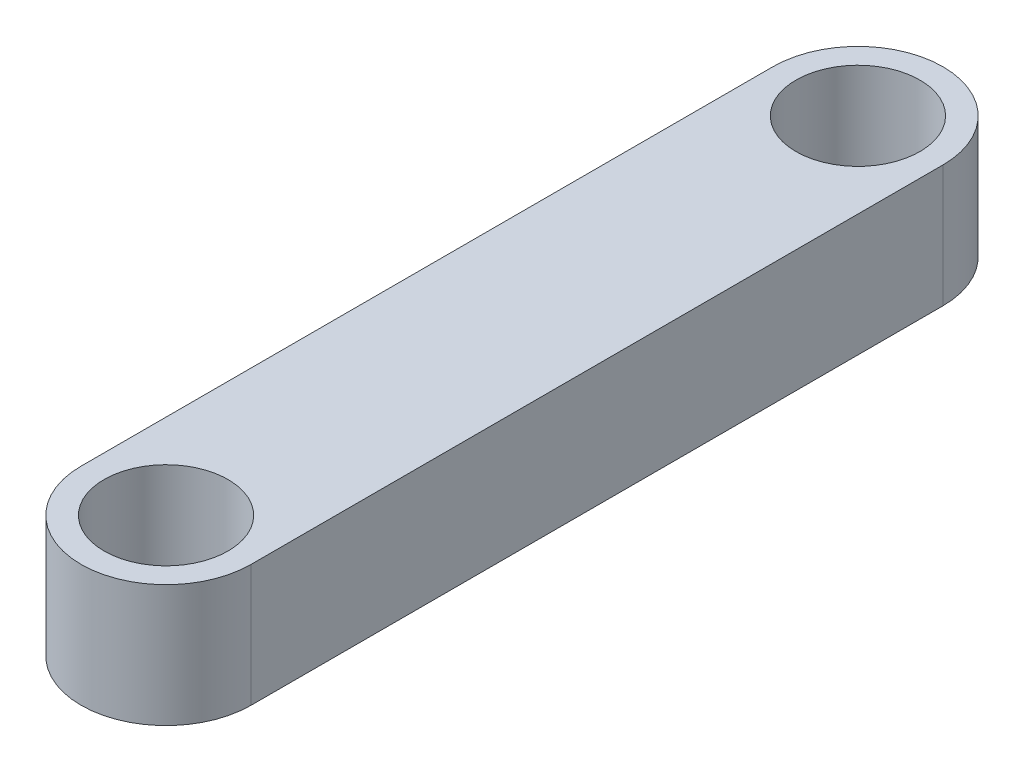
ISO-10303-21;
HEADER;
FILE_DESCRIPTION(('STEP AP214'),'2;1');
FILE_NAME('part.step','',(''),(''),'','','');
FILE_SCHEMA(('AUTOMOTIVE_DESIGN { 1 0 10303 214 1 1 1 1 }'));
ENDSEC;
DATA;
#1=APPLICATION_CONTEXT('core data for automotive mechanical design processes');
#2=APPLICATION_PROTOCOL_DEFINITION('international standard','automotive_design',2000,#1);
#3=PRODUCT_CONTEXT('',#1,'mechanical');
#4=PRODUCT('Part','Part','',(#3));
#5=PRODUCT_RELATED_PRODUCT_CATEGORY('part','',(#4));
#6=PRODUCT_DEFINITION_FORMATION('','',#4);
#7=PRODUCT_DEFINITION_CONTEXT('part definition',#1,'design');
#8=PRODUCT_DEFINITION('design','',#6,#7);
#9=PRODUCT_DEFINITION_SHAPE('','',#8);
#10=(LENGTH_UNIT() NAMED_UNIT(*) SI_UNIT(.MILLI.,.METRE.));
#11=(NAMED_UNIT(*) PLANE_ANGLE_UNIT() SI_UNIT($,.RADIAN.));
#12=(NAMED_UNIT(*) SI_UNIT($,.STERADIAN.) SOLID_ANGLE_UNIT());
#13=UNCERTAINTY_MEASURE_WITH_UNIT(LENGTH_MEASURE(1.E-05),#10,'distance_accuracy_value','');
#14=(GEOMETRIC_REPRESENTATION_CONTEXT(3) GLOBAL_UNCERTAINTY_ASSIGNED_CONTEXT((#13)) GLOBAL_UNIT_ASSIGNED_CONTEXT((#10,
#11,#12)) REPRESENTATION_CONTEXT('',''));
#15=CARTESIAN_POINT('',(0.,0.,0.));
#16=DIRECTION('',(0.,0.,1.));
#17=DIRECTION('',(1.,0.,0.));
#18=AXIS2_PLACEMENT_3D('',#15,#16,#17);
#19=CARTESIAN_POINT('',(4.425,6.35,0.));
#20=DIRECTION('',(-1.,0.,0.));
#21=DIRECTION('',(0.,0.,1.));
#22=AXIS2_PLACEMENT_3D('',#19,#20,#21);
#23=PLANE('',#22);
#24=DIRECTION('',(0.,0.,-1.));
#25=VECTOR('',#24,1.);
#26=CARTESIAN_POINT('',(4.425,0.,0.));
#27=LINE('',#26,#25);
#28=CARTESIAN_POINT('',(4.425,0.,28.));
#29=VERTEX_POINT('',#28);
#30=CARTESIAN_POINT('',(4.425,0.,-8.));
#31=VERTEX_POINT('',#30);
#32=EDGE_CURVE('E109',#29,#31,#27,.T.);
#33=ORIENTED_EDGE('',*,*,#32,.T.);
#34=DIRECTION('',(0.,-1.,0.));
#35=VECTOR('',#34,1.);
#36=CARTESIAN_POINT('',(4.425,6.35,-8.));
#37=LINE('',#36,#35);
#38=CARTESIAN_POINT('',(4.425,6.35,-8.));
#39=VERTEX_POINT('',#38);
#40=EDGE_CURVE('E11',#39,#31,#37,.T.);
#41=ORIENTED_EDGE('',*,*,#40,.F.);
#42=DIRECTION('',(0.,0.,-1.));
#43=VECTOR('',#42,1.);
#44=CARTESIAN_POINT('',(4.425,6.35,0.));
#45=LINE('',#44,#43);
#46=CARTESIAN_POINT('',(4.425,6.35,28.));
#47=VERTEX_POINT('',#46);
#48=EDGE_CURVE('E91',#47,#39,#45,.T.);
#49=ORIENTED_EDGE('',*,*,#48,.F.);
#50=DIRECTION('',(0.,-1.,0.));
#51=VECTOR('',#50,1.);
#52=CARTESIAN_POINT('',(4.425,6.35,28.));
#53=LINE('',#52,#51);
#54=EDGE_CURVE('E99',#47,#29,#53,.T.);
#55=ORIENTED_EDGE('',*,*,#54,.T.);
#56=EDGE_LOOP('',(#33,#41,#49,#55));
#57=FACE_BOUND('',#56,.T.);
#58=ADVANCED_FACE('F39',(#57),#23,.F.);
#59=CARTESIAN_POINT('',(0.,6.35,-8.));
#60=DIRECTION('',(0.,-1.,0.));
#61=DIRECTION('',(0.,0.,-1.));
#62=AXIS2_PLACEMENT_3D('',#59,#60,#61);
#63=CYLINDRICAL_SURFACE('',#62,4.425);
#64=CARTESIAN_POINT('',(0.,0.,-8.));
#65=DIRECTION('',(0.,1.,0.));
#66=DIRECTION('',(0.,0.,1.));
#67=AXIS2_PLACEMENT_3D('',#64,#65,#66);
#68=CIRCLE('',#67,4.425);
#69=CARTESIAN_POINT('',(-4.425,0.,-8.));
#70=VERTEX_POINT('',#69);
#71=EDGE_CURVE('E95',#31,#70,#68,.T.);
#72=ORIENTED_EDGE('',*,*,#71,.T.);
#73=DIRECTION('',(0.,-1.,0.));
#74=VECTOR('',#73,1.);
#75=CARTESIAN_POINT('',(-4.425,6.35,-8.));
#76=LINE('',#75,#74);
#77=CARTESIAN_POINT('',(-4.425,6.35,-8.));
#78=VERTEX_POINT('',#77);
#79=EDGE_CURVE('E48',#78,#70,#76,.T.);
#80=ORIENTED_EDGE('',*,*,#79,.F.);
#81=CARTESIAN_POINT('',(0.,6.35,-8.));
#82=DIRECTION('',(0.,1.,0.));
#83=DIRECTION('',(0.,0.,1.));
#84=AXIS2_PLACEMENT_3D('',#81,#82,#83);
#85=CIRCLE('',#84,4.425);
#86=EDGE_CURVE('E86',#39,#78,#85,.T.);
#87=ORIENTED_EDGE('',*,*,#86,.F.);
#88=ORIENTED_EDGE('',*,*,#40,.T.);
#89=EDGE_LOOP('',(#72,#80,#87,#88));
#90=FACE_BOUND('',#89,.T.);
#91=ADVANCED_FACE('F94',(#90),#63,.T.);
#92=CARTESIAN_POINT('',(-4.425,6.35,0.));
#93=DIRECTION('',(1.,0.,0.));
#94=DIRECTION('',(0.,0.,-1.));
#95=AXIS2_PLACEMENT_3D('',#92,#93,#94);
#96=PLANE('',#95);
#97=DIRECTION('',(0.,0.,1.));
#98=VECTOR('',#97,1.);
#99=CARTESIAN_POINT('',(-4.425,0.,0.));
#100=LINE('',#99,#98);
#101=CARTESIAN_POINT('',(-4.425,0.,28.));
#102=VERTEX_POINT('',#101);
#103=EDGE_CURVE('E73',#70,#102,#100,.T.);
#104=ORIENTED_EDGE('',*,*,#103,.T.);
#105=DIRECTION('',(0.,-1.,0.));
#106=VECTOR('',#105,1.);
#107=CARTESIAN_POINT('',(-4.425,6.35,28.));
#108=LINE('',#107,#106);
#109=CARTESIAN_POINT('',(-4.425,6.35,28.));
#110=VERTEX_POINT('',#109);
#111=EDGE_CURVE('E96',#110,#102,#108,.T.);
#112=ORIENTED_EDGE('',*,*,#111,.F.);
#113=DIRECTION('',(0.,0.,1.));
#114=VECTOR('',#113,1.);
#115=CARTESIAN_POINT('',(-4.425,6.35,0.));
#116=LINE('',#115,#114);
#117=EDGE_CURVE('E89',#78,#110,#116,.T.);
#118=ORIENTED_EDGE('',*,*,#117,.F.);
#119=ORIENTED_EDGE('',*,*,#79,.T.);
#120=EDGE_LOOP('',(#104,#112,#118,#119));
#121=FACE_BOUND('',#120,.T.);
#122=ADVANCED_FACE('F97',(#121),#96,.F.);
#123=CARTESIAN_POINT('',(0.,6.35,-8.));
#124=DIRECTION('',(0.,-1.,0.));
#125=DIRECTION('',(0.,0.,-1.));
#126=AXIS2_PLACEMENT_3D('',#123,#124,#125);
#127=CYLINDRICAL_SURFACE('',#126,3.225);
#128=CARTESIAN_POINT('',(0.,6.35,-8.));
#129=DIRECTION('',(0.,1.,0.));
#130=DIRECTION('',(0.,0.,1.));
#131=AXIS2_PLACEMENT_3D('',#128,#129,#130);
#132=CIRCLE('',#131,3.225);
#133=CARTESIAN_POINT('',(0.,6.35,-4.775));
#134=VERTEX_POINT('',#133);
#135=EDGE_CURVE('E122',#134,#134,#132,.T.);
#136=ORIENTED_EDGE('',*,*,#135,.T.);
#137=EDGE_LOOP('',(#136));
#138=FACE_BOUND('',#137,.T.);
#139=CARTESIAN_POINT('',(0.,0.,-8.));
#140=DIRECTION('',(0.,1.,0.));
#141=DIRECTION('',(0.,0.,1.));
#142=AXIS2_PLACEMENT_3D('',#139,#140,#141);
#143=CIRCLE('',#142,3.225);
#144=CARTESIAN_POINT('',(0.,0.,-4.775));
#145=VERTEX_POINT('',#144);
#146=EDGE_CURVE('E106',#145,#145,#143,.T.);
#147=ORIENTED_EDGE('',*,*,#146,.F.);
#148=EDGE_LOOP('',(#147));
#149=FACE_BOUND('',#148,.T.);
#150=ADVANCED_FACE('F136',(#138,#149),#127,.F.);
#151=CARTESIAN_POINT('',(0.,6.35,28.));
#152=DIRECTION('',(0.,-1.,0.));
#153=DIRECTION('',(0.,0.,-1.));
#154=AXIS2_PLACEMENT_3D('',#151,#152,#153);
#155=CYLINDRICAL_SURFACE('',#154,3.225);
#156=CARTESIAN_POINT('',(0.,6.35,28.));
#157=DIRECTION('',(0.,1.,0.));
#158=DIRECTION('',(0.,0.,1.));
#159=AXIS2_PLACEMENT_3D('',#156,#157,#158);
#160=CIRCLE('',#159,3.225);
#161=CARTESIAN_POINT('',(0.,6.35,31.225));
#162=VERTEX_POINT('',#161);
#163=EDGE_CURVE('E115',#162,#162,#160,.T.);
#164=ORIENTED_EDGE('',*,*,#163,.T.);
#165=EDGE_LOOP('',(#164));
#166=FACE_BOUND('',#165,.T.);
#167=CARTESIAN_POINT('',(0.,0.,28.));
#168=DIRECTION('',(0.,1.,0.));
#169=DIRECTION('',(0.,0.,1.));
#170=AXIS2_PLACEMENT_3D('',#167,#168,#169);
#171=CIRCLE('',#170,3.225);
#172=CARTESIAN_POINT('',(0.,0.,31.225));
#173=VERTEX_POINT('',#172);
#174=EDGE_CURVE('E103',#173,#173,#171,.T.);
#175=ORIENTED_EDGE('',*,*,#174,.F.);
#176=EDGE_LOOP('',(#175));
#177=FACE_BOUND('',#176,.T.);
#178=ADVANCED_FACE('F41',(#166,#177),#155,.F.);
#179=CARTESIAN_POINT('',(0.,6.35,28.));
#180=DIRECTION('',(0.,-1.,0.));
#181=DIRECTION('',(0.,0.,-1.));
#182=AXIS2_PLACEMENT_3D('',#179,#180,#181);
#183=CYLINDRICAL_SURFACE('',#182,4.425);
#184=CARTESIAN_POINT('',(0.,0.,28.));
#185=DIRECTION('',(0.,1.,0.));
#186=DIRECTION('',(0.,0.,1.));
#187=AXIS2_PLACEMENT_3D('',#184,#185,#186);
#188=CIRCLE('',#187,4.425);
#189=EDGE_CURVE('E79',#102,#29,#188,.T.);
#190=ORIENTED_EDGE('',*,*,#189,.T.);
#191=ORIENTED_EDGE('',*,*,#54,.F.);
#192=CARTESIAN_POINT('',(0.,6.35,28.));
#193=DIRECTION('',(0.,1.,0.));
#194=DIRECTION('',(0.,0.,1.));
#195=AXIS2_PLACEMENT_3D('',#192,#193,#194);
#196=CIRCLE('',#195,4.425);
#197=EDGE_CURVE('E56',#110,#47,#196,.T.);
#198=ORIENTED_EDGE('',*,*,#197,.F.);
#199=ORIENTED_EDGE('',*,*,#111,.T.);
#200=EDGE_LOOP('',(#190,#191,#198,#199));
#201=FACE_BOUND('',#200,.T.);
#202=ADVANCED_FACE('F117',(#201),#183,.T.);
#203=CARTESIAN_POINT('',(0.,6.35,0.));
#204=DIRECTION('',(0.,1.,0.));
#205=DIRECTION('',(0.,0.,1.));
#206=AXIS2_PLACEMENT_3D('',#203,#204,#205);
#207=PLANE('',#206);
#208=ORIENTED_EDGE('',*,*,#163,.F.);
#209=EDGE_LOOP('',(#208));
#210=FACE_BOUND('',#209,.T.);
#211=ORIENTED_EDGE('',*,*,#135,.F.);
#212=EDGE_LOOP('',(#211));
#213=FACE_BOUND('',#212,.T.);
#214=ORIENTED_EDGE('',*,*,#48,.T.);
#215=ORIENTED_EDGE('',*,*,#86,.T.);
#216=ORIENTED_EDGE('',*,*,#117,.T.);
#217=ORIENTED_EDGE('',*,*,#197,.T.);
#218=EDGE_LOOP('',(#214,#215,#216,#217));
#219=FACE_BOUND('',#218,.T.);
#220=ADVANCED_FACE('F87',(#210,#213,#219),#207,.T.);
#221=CARTESIAN_POINT('',(0.,0.,0.));
#222=DIRECTION('',(0.,1.,0.));
#223=DIRECTION('',(0.,0.,1.));
#224=AXIS2_PLACEMENT_3D('',#221,#222,#223);
#225=PLANE('',#224);
#226=ORIENTED_EDGE('',*,*,#174,.T.);
#227=EDGE_LOOP('',(#226));
#228=FACE_BOUND('',#227,.T.);
#229=ORIENTED_EDGE('',*,*,#146,.T.);
#230=EDGE_LOOP('',(#229));
#231=FACE_BOUND('',#230,.T.);
#232=ORIENTED_EDGE('',*,*,#32,.F.);
#233=ORIENTED_EDGE('',*,*,#189,.F.);
#234=ORIENTED_EDGE('',*,*,#103,.F.);
#235=ORIENTED_EDGE('',*,*,#71,.F.);
#236=EDGE_LOOP('',(#232,#233,#234,#235));
#237=FACE_BOUND('',#236,.T.);
#238=ADVANCED_FACE('F120',(#228,#231,#237),#225,.F.);
#239=CLOSED_SHELL('',(#58,#91,#122,#150,#178,#202,#220,#238));
#240=MANIFOLD_SOLID_BREP('B2',#239);
#241=ADVANCED_BREP_SHAPE_REPRESENTATION('',(#18,#240),#14);
#242=SHAPE_DEFINITION_REPRESENTATION(#9,#241);
ENDSEC;
END-ISO-10303-21;
